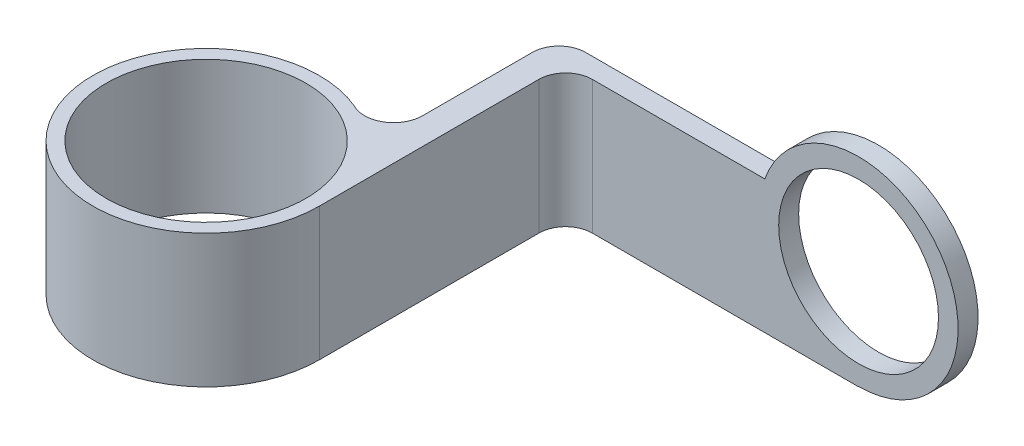
ISO-10303-21;
HEADER;
FILE_DESCRIPTION(('STEP AP214'),'2;1');
FILE_NAME('part.step','',(''),(''),'','','');
FILE_SCHEMA(('AUTOMOTIVE_DESIGN { 1 0 10303 214 1 1 1 1 }'));
ENDSEC;
DATA;
#1=APPLICATION_CONTEXT('core data for automotive mechanical design processes');
#2=APPLICATION_PROTOCOL_DEFINITION('international standard','automotive_design',2000,#1);
#3=PRODUCT_CONTEXT('',#1,'mechanical');
#4=PRODUCT('Part','Part','',(#3));
#5=PRODUCT_RELATED_PRODUCT_CATEGORY('part','',(#4));
#6=PRODUCT_DEFINITION_FORMATION('','',#4);
#7=PRODUCT_DEFINITION_CONTEXT('part definition',#1,'design');
#8=PRODUCT_DEFINITION('design','',#6,#7);
#9=PRODUCT_DEFINITION_SHAPE('','',#8);
#10=(LENGTH_UNIT() NAMED_UNIT(*) SI_UNIT(.MILLI.,.METRE.));
#11=(NAMED_UNIT(*) PLANE_ANGLE_UNIT() SI_UNIT($,.RADIAN.));
#12=(NAMED_UNIT(*) SI_UNIT($,.STERADIAN.) SOLID_ANGLE_UNIT());
#13=UNCERTAINTY_MEASURE_WITH_UNIT(LENGTH_MEASURE(1.E-05),#10,'distance_accuracy_value','');
#14=(GEOMETRIC_REPRESENTATION_CONTEXT(3) GLOBAL_UNCERTAINTY_ASSIGNED_CONTEXT((#13)) GLOBAL_UNIT_ASSIGNED_CONTEXT((#10,
#11,#12)) REPRESENTATION_CONTEXT('',''));
#15=CARTESIAN_POINT('',(0.,0.,0.));
#16=DIRECTION('',(0.,0.,1.));
#17=DIRECTION('',(1.,0.,0.));
#18=AXIS2_PLACEMENT_3D('',#15,#16,#17);
#19=CARTESIAN_POINT('',(-48.7252234820575,20.,-19.5303991848982));
#20=DIRECTION('',(0.,-1.,0.));
#21=DIRECTION('',(0.,0.,-1.));
#22=AXIS2_PLACEMENT_3D('',#19,#20,#21);
#23=CYLINDRICAL_SURFACE('',#22,4.36789644057167);
#24=CARTESIAN_POINT('',(-48.7252234820575,0.,-19.5303991848982));
#25=DIRECTION('',(0.,1.,0.));
#26=DIRECTION('',(0.,0.,1.));
#27=AXIS2_PLACEMENT_3D('',#24,#25,#26);
#28=CIRCLE('',#27,4.36789644057167);
#29=CARTESIAN_POINT('',(-50.7801774807738,0.,-15.6760920644525));
#30=VERTEX_POINT('',#29);
#31=CARTESIAN_POINT('',(-44.35742140105,0.,-19.5016886170619));
#32=VERTEX_POINT('',#31);
#33=EDGE_CURVE('E141',#30,#32,#28,.T.);
#34=ORIENTED_EDGE('',*,*,#33,.F.);
#35=DIRECTION('',(0.,-1.,0.));
#36=VECTOR('',#35,1.);
#37=CARTESIAN_POINT('',(-50.7801774807738,20.,-15.6760920644525));
#38=LINE('',#37,#36);
#39=CARTESIAN_POINT('',(-50.7801774807738,20.,-15.6760920644525));
#40=VERTEX_POINT('',#39);
#41=EDGE_CURVE('E11',#40,#30,#38,.T.);
#42=ORIENTED_EDGE('',*,*,#41,.F.);
#43=CARTESIAN_POINT('',(-48.7252234820575,20.,-19.5303991848982));
#44=DIRECTION('',(0.,1.,0.));
#45=DIRECTION('',(0.,0.,1.));
#46=AXIS2_PLACEMENT_3D('',#43,#44,#45);
#47=CIRCLE('',#46,4.36789644057167);
#48=CARTESIAN_POINT('',(-44.35742140105,20.,-19.5016886170619));
#49=VERTEX_POINT('',#48);
#50=EDGE_CURVE('E168',#40,#49,#47,.T.);
#51=ORIENTED_EDGE('',*,*,#50,.T.);
#52=DIRECTION('',(0.,-1.,0.));
#53=VECTOR('',#52,1.);
#54=CARTESIAN_POINT('',(-44.35742140105,20.,-19.5016886170619));
#55=LINE('',#54,#53);
#56=EDGE_CURVE('E89',#49,#32,#55,.T.);
#57=ORIENTED_EDGE('',*,*,#56,.T.);
#58=EDGE_LOOP('',(#34,#42,#51,#57));
#59=FACE_BOUND('',#58,.T.);
#60=ADVANCED_FACE('F35',(#59),#23,.F.);
#61=CARTESIAN_POINT('',(-57.35742140105,20.,0.));
#62=DIRECTION('',(0.,-1.,0.));
#63=DIRECTION('',(0.,0.,-1.));
#64=AXIS2_PLACEMENT_3D('',#61,#62,#63);
#65=CYLINDRICAL_SURFACE('',#64,17.);
#66=CARTESIAN_POINT('',(-57.35742140105,0.,0.));
#67=DIRECTION('',(0.,1.,0.));
#68=DIRECTION('',(0.,0.,1.));
#69=AXIS2_PLACEMENT_3D('',#66,#67,#68);
#70=CIRCLE('',#69,17.);
#71=CARTESIAN_POINT('',(-40.35742140105,0.,0.));
#72=VERTEX_POINT('',#71);
#73=EDGE_CURVE('E144',#30,#72,#70,.T.);
#74=ORIENTED_EDGE('',*,*,#73,.T.);
#75=DIRECTION('',(0.,-1.,0.));
#76=VECTOR('',#75,1.);
#77=CARTESIAN_POINT('',(-40.35742140105,20.,0.));
#78=LINE('',#77,#76);
#79=CARTESIAN_POINT('',(-40.35742140105,20.,0.));
#80=VERTEX_POINT('',#79);
#81=EDGE_CURVE('E43',#80,#72,#78,.T.);
#82=ORIENTED_EDGE('',*,*,#81,.F.);
#83=CARTESIAN_POINT('',(-57.35742140105,20.,0.));
#84=DIRECTION('',(0.,1.,0.));
#85=DIRECTION('',(0.,0.,1.));
#86=AXIS2_PLACEMENT_3D('',#83,#84,#85);
#87=CIRCLE('',#86,17.);
#88=EDGE_CURVE('E199',#40,#80,#87,.T.);
#89=ORIENTED_EDGE('',*,*,#88,.F.);
#90=ORIENTED_EDGE('',*,*,#41,.T.);
#91=EDGE_LOOP('',(#74,#82,#89,#90));
#92=FACE_BOUND('',#91,.T.);
#93=ADVANCED_FACE('F186',(#92),#65,.T.);
#94=CARTESIAN_POINT('',(-40.35742140105,20.,0.));
#95=DIRECTION('',(1.,0.,0.));
#96=DIRECTION('',(0.,0.,-1.));
#97=AXIS2_PLACEMENT_3D('',#94,#95,#96);
#98=PLANE('',#97);
#99=DIRECTION('',(0.,0.,1.));
#100=VECTOR('',#99,1.);
#101=CARTESIAN_POINT('',(-40.35742140105,0.,0.));
#102=LINE('',#101,#100);
#103=CARTESIAN_POINT('',(-40.35742140105,0.,-33.));
#104=VERTEX_POINT('',#103);
#105=EDGE_CURVE('E148',#104,#72,#102,.T.);
#106=ORIENTED_EDGE('',*,*,#105,.F.);
#107=DIRECTION('',(0.,-1.,0.));
#108=VECTOR('',#107,1.);
#109=CARTESIAN_POINT('',(-40.35742140105,20.,-33.));
#110=LINE('',#109,#108);
#111=CARTESIAN_POINT('',(-40.35742140105,20.,-33.));
#112=VERTEX_POINT('',#111);
#113=EDGE_CURVE('E176',#112,#104,#110,.T.);
#114=ORIENTED_EDGE('',*,*,#113,.F.);
#115=DIRECTION('',(0.,0.,1.));
#116=VECTOR('',#115,1.);
#117=CARTESIAN_POINT('',(-40.35742140105,20.,0.));
#118=LINE('',#117,#116);
#119=EDGE_CURVE('E183',#112,#80,#118,.T.);
#120=ORIENTED_EDGE('',*,*,#119,.T.);
#121=ORIENTED_EDGE('',*,*,#81,.T.);
#122=EDGE_LOOP('',(#106,#114,#120,#121));
#123=FACE_BOUND('',#122,.T.);
#124=ADVANCED_FACE('F181',(#123),#98,.T.);
#125=CARTESIAN_POINT('',(-36.35742140105,20.,-33.));
#126=DIRECTION('',(0.,-1.,0.));
#127=DIRECTION('',(0.,0.,-1.));
#128=AXIS2_PLACEMENT_3D('',#125,#126,#127);
#129=CYLINDRICAL_SURFACE('',#128,4.);
#130=CARTESIAN_POINT('',(-36.35742140105,0.,-33.));
#131=DIRECTION('',(0.,1.,0.));
#132=DIRECTION('',(0.,0.,1.));
#133=AXIS2_PLACEMENT_3D('',#130,#131,#132);
#134=CIRCLE('',#133,4.);
#135=CARTESIAN_POINT('',(-36.35742140105,0.,-37.));
#136=VERTEX_POINT('',#135);
#137=EDGE_CURVE('E151',#104,#136,#134,.F.);
#138=ORIENTED_EDGE('',*,*,#137,.T.);
#139=DIRECTION('',(0.,-1.,0.));
#140=VECTOR('',#139,1.);
#141=CARTESIAN_POINT('',(-36.35742140105,20.,-37.));
#142=LINE('',#141,#140);
#143=CARTESIAN_POINT('',(-36.35742140105,20.,-37.));
#144=VERTEX_POINT('',#143);
#145=EDGE_CURVE('E174',#144,#136,#142,.T.);
#146=ORIENTED_EDGE('',*,*,#145,.F.);
#147=CARTESIAN_POINT('',(-36.35742140105,20.,-33.));
#148=DIRECTION('',(0.,1.,0.));
#149=DIRECTION('',(0.,0.,1.));
#150=AXIS2_PLACEMENT_3D('',#147,#148,#149);
#151=CIRCLE('',#150,4.);
#152=EDGE_CURVE('E197',#112,#144,#151,.F.);
#153=ORIENTED_EDGE('',*,*,#152,.F.);
#154=ORIENTED_EDGE('',*,*,#113,.T.);
#155=EDGE_LOOP('',(#138,#146,#153,#154));
#156=FACE_BOUND('',#155,.T.);
#157=ADVANCED_FACE('F194',(#156),#129,.F.);
#158=CARTESIAN_POINT('',(0.,20.,-37.));
#159=DIRECTION('',(0.,0.,1.));
#160=DIRECTION('',(1.,0.,0.));
#161=AXIS2_PLACEMENT_3D('',#158,#159,#160);
#162=PLANE('',#161);
#163=DIRECTION('',(0.,-1.,0.));
#164=VECTOR('',#163,1.);
#165=CARTESIAN_POINT('',(3.64257859894996,20.,-37.));
#166=LINE('',#165,#164);
#167=CARTESIAN_POINT('',(3.64257859894996,0.0518737164874189,-37.));
#168=VERTEX_POINT('',#167);
#169=CARTESIAN_POINT('',(3.64257859894996,0.,-37.));
#170=VERTEX_POINT('',#169);
#171=EDGE_CURVE('E172',#168,#170,#166,.T.);
#172=ORIENTED_EDGE('',*,*,#171,.F.);
#173=CARTESIAN_POINT('',(3.64257859894996,15.,-37.));
#174=DIRECTION('',(0.,0.,-1.));
#175=DIRECTION('',(-1.,0.,0.));
#176=AXIS2_PLACEMENT_3D('',#173,#174,#175);
#177=CIRCLE('',#176,14.9481262835126);
#178=CARTESIAN_POINT('',(-10.4445247011554,20.,-37.));
#179=VERTEX_POINT('',#178);
#180=EDGE_CURVE('E210',#179,#168,#177,.T.);
#181=ORIENTED_EDGE('',*,*,#180,.F.);
#182=DIRECTION('',(-1.,0.,0.));
#183=VECTOR('',#182,1.);
#184=CARTESIAN_POINT('',(0.,20.,-37.));
#185=LINE('',#184,#183);
#186=EDGE_CURVE('E131',#179,#144,#185,.T.);
#187=ORIENTED_EDGE('',*,*,#186,.T.);
#188=ORIENTED_EDGE('',*,*,#145,.T.);
#189=DIRECTION('',(-1.,0.,0.));
#190=VECTOR('',#189,1.);
#191=CARTESIAN_POINT('',(0.,0.,-37.));
#192=LINE('',#191,#190);
#193=EDGE_CURVE('E154',#170,#136,#192,.T.);
#194=ORIENTED_EDGE('',*,*,#193,.F.);
#195=EDGE_LOOP('',(#172,#181,#187,#188,#194));
#196=FACE_BOUND('',#195,.T.);
#197=CARTESIAN_POINT('',(3.64257859894996,15.,-37.));
#198=DIRECTION('',(0.,0.,1.));
#199=DIRECTION('',(1.,0.,0.));
#200=AXIS2_PLACEMENT_3D('',#197,#198,#199);
#201=CIRCLE('',#200,12.);
#202=CARTESIAN_POINT('',(15.64257859895,15.,-37.));
#203=VERTEX_POINT('',#202);
#204=EDGE_CURVE('E145',#203,#203,#201,.T.);
#205=ORIENTED_EDGE('',*,*,#204,.F.);
#206=EDGE_LOOP('',(#205));
#207=FACE_BOUND('',#206,.T.);
#208=ADVANCED_FACE('F206',(#196,#207),#162,.T.);
#209=CARTESIAN_POINT('',(3.64257859894996,20.,0.));
#210=DIRECTION('',(1.,0.,0.));
#211=DIRECTION('',(0.,0.,-1.));
#212=AXIS2_PLACEMENT_3D('',#209,#210,#211);
#213=PLANE('',#212);
#214=DIRECTION('',(0.,0.,-1.));
#215=VECTOR('',#214,1.);
#216=CARTESIAN_POINT('',(3.64257859894996,0.0518737164874189,-37.));
#217=LINE('',#216,#215);
#218=CARTESIAN_POINT('',(3.64257859894996,0.0518737164874189,-40.));
#219=VERTEX_POINT('',#218);
#220=EDGE_CURVE('E219',#168,#219,#217,.T.);
#221=ORIENTED_EDGE('',*,*,#220,.F.);
#222=ORIENTED_EDGE('',*,*,#171,.T.);
#223=DIRECTION('',(0.,0.,1.));
#224=VECTOR('',#223,1.);
#225=CARTESIAN_POINT('',(3.64257859894996,0.,0.));
#226=LINE('',#225,#224);
#227=CARTESIAN_POINT('',(3.64257859894996,0.,-40.));
#228=VERTEX_POINT('',#227);
#229=EDGE_CURVE('E157',#228,#170,#226,.T.);
#230=ORIENTED_EDGE('',*,*,#229,.F.);
#231=DIRECTION('',(0.,-1.,0.));
#232=VECTOR('',#231,1.);
#233=CARTESIAN_POINT('',(3.64257859894996,20.,-40.));
#234=LINE('',#233,#232);
#235=EDGE_CURVE('E122',#219,#228,#234,.T.);
#236=ORIENTED_EDGE('',*,*,#235,.F.);
#237=EDGE_LOOP('',(#221,#222,#230,#236));
#238=FACE_BOUND('',#237,.T.);
#239=ADVANCED_FACE('F243',(#238),#213,.T.);
#240=CARTESIAN_POINT('',(0.,20.,-40.));
#241=DIRECTION('',(0.,0.,-1.));
#242=DIRECTION('',(-1.,0.,0.));
#243=AXIS2_PLACEMENT_3D('',#240,#241,#242);
#244=PLANE('',#243);
#245=CARTESIAN_POINT('',(3.64257859894996,15.,-40.));
#246=DIRECTION('',(0.,0.,-1.));
#247=DIRECTION('',(-1.,0.,0.));
#248=AXIS2_PLACEMENT_3D('',#245,#246,#247);
#249=CIRCLE('',#248,14.9481262835126);
#250=CARTESIAN_POINT('',(-10.4445247011554,20.,-40.));
#251=VERTEX_POINT('',#250);
#252=EDGE_CURVE('E216',#251,#219,#249,.T.);
#253=ORIENTED_EDGE('',*,*,#252,.T.);
#254=ORIENTED_EDGE('',*,*,#235,.T.);
#255=DIRECTION('',(1.,0.,0.));
#256=VECTOR('',#255,1.);
#257=CARTESIAN_POINT('',(0.,0.,-40.));
#258=LINE('',#257,#256);
#259=CARTESIAN_POINT('',(-40.35742140105,0.,-40.));
#260=VERTEX_POINT('',#259);
#261=EDGE_CURVE('E117',#260,#228,#258,.T.);
#262=ORIENTED_EDGE('',*,*,#261,.F.);
#263=DIRECTION('',(0.,-1.,0.));
#264=VECTOR('',#263,1.);
#265=CARTESIAN_POINT('',(-40.35742140105,20.,-40.));
#266=LINE('',#265,#264);
#267=CARTESIAN_POINT('',(-40.35742140105,20.,-40.));
#268=VERTEX_POINT('',#267);
#269=EDGE_CURVE('E109',#268,#260,#266,.T.);
#270=ORIENTED_EDGE('',*,*,#269,.F.);
#271=DIRECTION('',(1.,0.,0.));
#272=VECTOR('',#271,1.);
#273=CARTESIAN_POINT('',(0.,20.,-40.));
#274=LINE('',#273,#272);
#275=EDGE_CURVE('E115',#268,#251,#274,.T.);
#276=ORIENTED_EDGE('',*,*,#275,.T.);
#277=EDGE_LOOP('',(#253,#254,#262,#270,#276));
#278=FACE_BOUND('',#277,.T.);
#279=CARTESIAN_POINT('',(3.64257859894996,15.,-40.));
#280=DIRECTION('',(0.,0.,-1.));
#281=DIRECTION('',(-1.,0.,0.));
#282=AXIS2_PLACEMENT_3D('',#279,#280,#281);
#283=CIRCLE('',#282,12.);
#284=CARTESIAN_POINT('',(-8.35742140105004,15.,-40.));
#285=VERTEX_POINT('',#284);
#286=EDGE_CURVE('E225',#285,#285,#283,.T.);
#287=ORIENTED_EDGE('',*,*,#286,.F.);
#288=EDGE_LOOP('',(#287));
#289=FACE_BOUND('',#288,.T.);
#290=ADVANCED_FACE('F112',(#278,#289),#244,.T.);
#291=CARTESIAN_POINT('',(-40.35742140105,20.,-36.));
#292=DIRECTION('',(0.,-1.,0.));
#293=DIRECTION('',(0.,0.,-1.));
#294=AXIS2_PLACEMENT_3D('',#291,#292,#293);
#295=CYLINDRICAL_SURFACE('',#294,4.);
#296=CARTESIAN_POINT('',(-40.35742140105,0.,-36.));
#297=DIRECTION('',(0.,1.,0.));
#298=DIRECTION('',(0.,0.,1.));
#299=AXIS2_PLACEMENT_3D('',#296,#297,#298);
#300=CIRCLE('',#299,4.);
#301=CARTESIAN_POINT('',(-44.35742140105,0.,-36.));
#302=VERTEX_POINT('',#301);
#303=EDGE_CURVE('E161',#302,#260,#300,.F.);
#304=ORIENTED_EDGE('',*,*,#303,.F.);
#305=DIRECTION('',(0.,-1.,0.));
#306=VECTOR('',#305,1.);
#307=CARTESIAN_POINT('',(-44.35742140105,20.,-36.));
#308=LINE('',#307,#306);
#309=CARTESIAN_POINT('',(-44.35742140105,20.,-36.));
#310=VERTEX_POINT('',#309);
#311=EDGE_CURVE('E82',#310,#302,#308,.T.);
#312=ORIENTED_EDGE('',*,*,#311,.F.);
#313=CARTESIAN_POINT('',(-40.35742140105,20.,-36.));
#314=DIRECTION('',(0.,1.,0.));
#315=DIRECTION('',(0.,0.,1.));
#316=AXIS2_PLACEMENT_3D('',#313,#314,#315);
#317=CIRCLE('',#316,4.);
#318=EDGE_CURVE('E127',#310,#268,#317,.F.);
#319=ORIENTED_EDGE('',*,*,#318,.T.);
#320=ORIENTED_EDGE('',*,*,#269,.T.);
#321=EDGE_LOOP('',(#304,#312,#319,#320));
#322=FACE_BOUND('',#321,.T.);
#323=ADVANCED_FACE('F133',(#322),#295,.T.);
#324=CARTESIAN_POINT('',(-44.35742140105,20.,0.));
#325=DIRECTION('',(1.,0.,0.));
#326=DIRECTION('',(0.,0.,-1.));
#327=AXIS2_PLACEMENT_3D('',#324,#325,#326);
#328=PLANE('',#327);
#329=DIRECTION('',(0.,0.,1.));
#330=VECTOR('',#329,1.);
#331=CARTESIAN_POINT('',(-44.35742140105,0.,0.));
#332=LINE('',#331,#330);
#333=EDGE_CURVE('E163',#302,#32,#332,.T.);
#334=ORIENTED_EDGE('',*,*,#333,.T.);
#335=ORIENTED_EDGE('',*,*,#56,.F.);
#336=DIRECTION('',(0.,0.,1.));
#337=VECTOR('',#336,1.);
#338=CARTESIAN_POINT('',(-44.35742140105,20.,0.));
#339=LINE('',#338,#337);
#340=EDGE_CURVE('E51',#310,#49,#339,.T.);
#341=ORIENTED_EDGE('',*,*,#340,.F.);
#342=ORIENTED_EDGE('',*,*,#311,.T.);
#343=EDGE_LOOP('',(#334,#335,#341,#342));
#344=FACE_BOUND('',#343,.T.);
#345=ADVANCED_FACE('F251',(#344),#328,.F.);
#346=CARTESIAN_POINT('',(-57.35742140105,20.,0.));
#347=DIRECTION('',(0.,-1.,0.));
#348=DIRECTION('',(0.,0.,-1.));
#349=AXIS2_PLACEMENT_3D('',#346,#347,#348);
#350=CYLINDRICAL_SURFACE('',#349,15.);
#351=CARTESIAN_POINT('',(-57.35742140105,20.,0.));
#352=DIRECTION('',(0.,1.,0.));
#353=DIRECTION('',(0.,0.,1.));
#354=AXIS2_PLACEMENT_3D('',#351,#352,#353);
#355=CIRCLE('',#354,15.);
#356=CARTESIAN_POINT('',(-57.35742140105,20.,15.));
#357=VERTEX_POINT('',#356);
#358=EDGE_CURVE('E135',#357,#357,#355,.T.);
#359=ORIENTED_EDGE('',*,*,#358,.T.);
#360=EDGE_LOOP('',(#359));
#361=FACE_BOUND('',#360,.T.);
#362=CARTESIAN_POINT('',(-57.35742140105,0.,0.));
#363=DIRECTION('',(0.,1.,0.));
#364=DIRECTION('',(0.,0.,1.));
#365=AXIS2_PLACEMENT_3D('',#362,#363,#364);
#366=CIRCLE('',#365,15.);
#367=CARTESIAN_POINT('',(-57.35742140105,0.,15.));
#368=VERTEX_POINT('',#367);
#369=EDGE_CURVE('E165',#368,#368,#366,.T.);
#370=ORIENTED_EDGE('',*,*,#369,.F.);
#371=EDGE_LOOP('',(#370));
#372=FACE_BOUND('',#371,.T.);
#373=ADVANCED_FACE('F254',(#361,#372),#350,.F.);
#374=CARTESIAN_POINT('',(0.,20.,0.));
#375=DIRECTION('',(0.,1.,0.));
#376=DIRECTION('',(0.,0.,1.));
#377=AXIS2_PLACEMENT_3D('',#374,#375,#376);
#378=PLANE('',#377);
#379=DIRECTION('',(0.,0.,-1.));
#380=VECTOR('',#379,1.);
#381=CARTESIAN_POINT('',(-10.4445247011554,20.,-37.));
#382=LINE('',#381,#380);
#383=EDGE_CURVE('E130',#179,#251,#382,.T.);
#384=ORIENTED_EDGE('',*,*,#383,.T.);
#385=ORIENTED_EDGE('',*,*,#275,.F.);
#386=ORIENTED_EDGE('',*,*,#318,.F.);
#387=ORIENTED_EDGE('',*,*,#340,.T.);
#388=ORIENTED_EDGE('',*,*,#50,.F.);
#389=ORIENTED_EDGE('',*,*,#88,.T.);
#390=ORIENTED_EDGE('',*,*,#119,.F.);
#391=ORIENTED_EDGE('',*,*,#152,.T.);
#392=ORIENTED_EDGE('',*,*,#186,.F.);
#393=EDGE_LOOP('',(#384,#385,#386,#387,#388,#389,#390,#391,#392));
#394=FACE_BOUND('',#393,.T.);
#395=ORIENTED_EDGE('',*,*,#358,.F.);
#396=EDGE_LOOP('',(#395));
#397=FACE_BOUND('',#396,.T.);
#398=ADVANCED_FACE('F125',(#394,#397),#378,.T.);
#399=CARTESIAN_POINT('',(0.,0.,0.));
#400=DIRECTION('',(0.,1.,0.));
#401=DIRECTION('',(0.,0.,1.));
#402=AXIS2_PLACEMENT_3D('',#399,#400,#401);
#403=PLANE('',#402);
#404=ORIENTED_EDGE('',*,*,#33,.T.);
#405=ORIENTED_EDGE('',*,*,#333,.F.);
#406=ORIENTED_EDGE('',*,*,#303,.T.);
#407=ORIENTED_EDGE('',*,*,#261,.T.);
#408=ORIENTED_EDGE('',*,*,#229,.T.);
#409=ORIENTED_EDGE('',*,*,#193,.T.);
#410=ORIENTED_EDGE('',*,*,#137,.F.);
#411=ORIENTED_EDGE('',*,*,#105,.T.);
#412=ORIENTED_EDGE('',*,*,#73,.F.);
#413=EDGE_LOOP('',(#404,#405,#406,#407,#408,#409,#410,#411,#412));
#414=FACE_BOUND('',#413,.T.);
#415=ORIENTED_EDGE('',*,*,#369,.T.);
#416=EDGE_LOOP('',(#415));
#417=FACE_BOUND('',#416,.T.);
#418=ADVANCED_FACE('F189',(#414,#417),#403,.F.);
#419=CARTESIAN_POINT('',(3.64257859894996,15.,-19.));
#420=DIRECTION('',(0.,0.,-1.));
#421=DIRECTION('',(-1.,0.,0.));
#422=AXIS2_PLACEMENT_3D('',#419,#420,#421);
#423=CYLINDRICAL_SURFACE('',#422,12.);
#424=ORIENTED_EDGE('',*,*,#204,.T.);
#425=EDGE_LOOP('',(#424));
#426=FACE_BOUND('',#425,.T.);
#427=ORIENTED_EDGE('',*,*,#286,.T.);
#428=EDGE_LOOP('',(#427));
#429=FACE_BOUND('',#428,.T.);
#430=ADVANCED_FACE('F260',(#426,#429),#423,.F.);
#431=CARTESIAN_POINT('',(3.64257859894996,15.,-37.));
#432=DIRECTION('',(0.,0.,-1.));
#433=DIRECTION('',(-1.,0.,0.));
#434=AXIS2_PLACEMENT_3D('',#431,#432,#433);
#435=CYLINDRICAL_SURFACE('',#434,14.9481262835126);
#436=ORIENTED_EDGE('',*,*,#252,.F.);
#437=ORIENTED_EDGE('',*,*,#383,.F.);
#438=ORIENTED_EDGE('',*,*,#180,.T.);
#439=ORIENTED_EDGE('',*,*,#220,.T.);
#440=EDGE_LOOP('',(#436,#437,#438,#439));
#441=FACE_BOUND('',#440,.T.);
#442=ADVANCED_FACE('F217',(#441),#435,.T.);
#443=CLOSED_SHELL('',(#60,#93,#124,#157,#208,#239,#290,#323,#345,#373,#398,#418,#430,#442));
#444=MANIFOLD_SOLID_BREP('B2',#443);
#445=ADVANCED_BREP_SHAPE_REPRESENTATION('',(#18,#444),#14);
#446=SHAPE_DEFINITION_REPRESENTATION(#9,#445);
ENDSEC;
END-ISO-10303-21;
